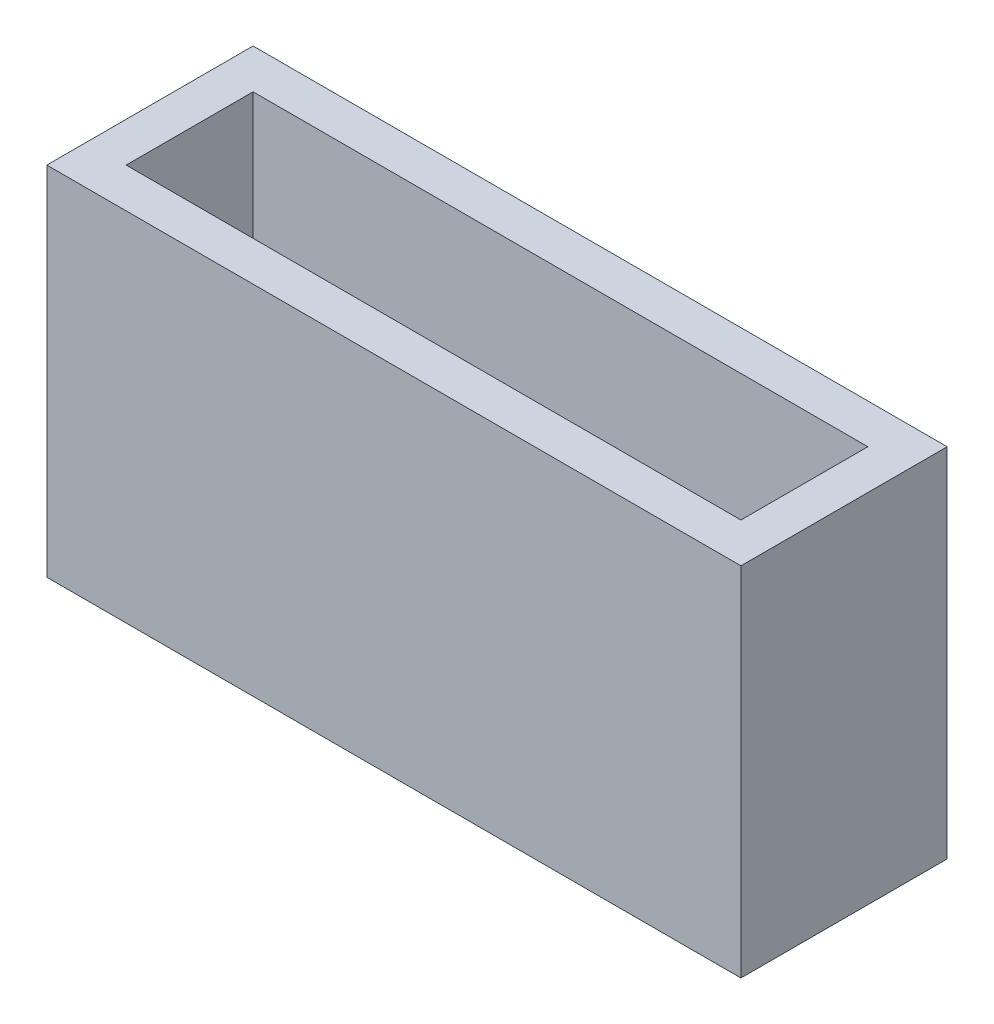
ISO-10303-21;
HEADER;
FILE_DESCRIPTION(('STEP AP214'),'2;1');
FILE_NAME('part.step','',(''),(''),'','','');
FILE_SCHEMA(('AUTOMOTIVE_DESIGN { 1 0 10303 214 1 1 1 1 }'));
ENDSEC;
DATA;
#1=APPLICATION_CONTEXT('core data for automotive mechanical design processes');
#2=APPLICATION_PROTOCOL_DEFINITION('international standard','automotive_design',2000,#1);
#3=PRODUCT_CONTEXT('',#1,'mechanical');
#4=PRODUCT('Part','Part','',(#3));
#5=PRODUCT_RELATED_PRODUCT_CATEGORY('part','',(#4));
#6=PRODUCT_DEFINITION_FORMATION('','',#4);
#7=PRODUCT_DEFINITION_CONTEXT('part definition',#1,'design');
#8=PRODUCT_DEFINITION('design','',#6,#7);
#9=PRODUCT_DEFINITION_SHAPE('','',#8);
#10=(LENGTH_UNIT() NAMED_UNIT(*) SI_UNIT(.MILLI.,.METRE.));
#11=(NAMED_UNIT(*) PLANE_ANGLE_UNIT() SI_UNIT($,.RADIAN.));
#12=(NAMED_UNIT(*) SI_UNIT($,.STERADIAN.) SOLID_ANGLE_UNIT());
#13=UNCERTAINTY_MEASURE_WITH_UNIT(LENGTH_MEASURE(1.E-05),#10,'distance_accuracy_value','');
#14=(GEOMETRIC_REPRESENTATION_CONTEXT(3) GLOBAL_UNCERTAINTY_ASSIGNED_CONTEXT((#13)) GLOBAL_UNIT_ASSIGNED_CONTEXT((#10,
#11,#12)) REPRESENTATION_CONTEXT('',''));
#15=CARTESIAN_POINT('',(0.,0.,0.));
#16=DIRECTION('',(0.,0.,1.));
#17=DIRECTION('',(1.,0.,0.));
#18=AXIS2_PLACEMENT_3D('',#15,#16,#17);
#19=CARTESIAN_POINT('',(0.,7.5,0.));
#20=DIRECTION('',(0.,1.,0.));
#21=DIRECTION('',(0.,0.,1.));
#22=AXIS2_PLACEMENT_3D('',#19,#20,#21);
#23=PLANE('',#22);
#24=DIRECTION('',(1.,0.,0.));
#25=VECTOR('',#24,1.);
#26=CARTESIAN_POINT('',(-1.,7.5,1.));
#27=LINE('',#26,#25);
#28=CARTESIAN_POINT('',(-1.,7.5,1.));
#29=VERTEX_POINT('',#28);
#30=CARTESIAN_POINT('',(16.5,7.5,1.));
#31=VERTEX_POINT('',#30);
#32=EDGE_CURVE('E176',#29,#31,#27,.T.);
#33=ORIENTED_EDGE('',*,*,#32,.T.);
#34=DIRECTION('',(0.,0.,-1.));
#35=VECTOR('',#34,1.);
#36=CARTESIAN_POINT('',(16.5,7.5,1.));
#37=LINE('',#36,#35);
#38=CARTESIAN_POINT('',(16.5,7.5,-4.2));
#39=VERTEX_POINT('',#38);
#40=EDGE_CURVE('E179',#31,#39,#37,.T.);
#41=ORIENTED_EDGE('',*,*,#40,.T.);
#42=DIRECTION('',(-1.,0.,0.));
#43=VECTOR('',#42,1.);
#44=CARTESIAN_POINT('',(-1.,7.5,-4.2));
#45=LINE('',#44,#43);
#46=CARTESIAN_POINT('',(-1.,7.5,-4.2));
#47=VERTEX_POINT('',#46);
#48=EDGE_CURVE('E182',#39,#47,#45,.T.);
#49=ORIENTED_EDGE('',*,*,#48,.T.);
#50=DIRECTION('',(0.,0.,1.));
#51=VECTOR('',#50,1.);
#52=CARTESIAN_POINT('',(-1.,7.5,1.));
#53=LINE('',#52,#51);
#54=EDGE_CURVE('E63',#47,#29,#53,.T.);
#55=ORIENTED_EDGE('',*,*,#54,.T.);
#56=EDGE_LOOP('',(#33,#41,#49,#55));
#57=FACE_BOUND('',#56,.T.);
#58=DIRECTION('',(1.,0.,0.));
#59=VECTOR('',#58,1.);
#60=CARTESIAN_POINT('',(0.,7.5,0.));
#61=LINE('',#60,#59);
#62=CARTESIAN_POINT('',(0.,7.5,0.));
#63=VERTEX_POINT('',#62);
#64=CARTESIAN_POINT('',(15.5,7.5,0.));
#65=VERTEX_POINT('',#64);
#66=EDGE_CURVE('E140',#63,#65,#61,.T.);
#67=ORIENTED_EDGE('',*,*,#66,.F.);
#68=DIRECTION('',(0.,0.,1.));
#69=VECTOR('',#68,1.);
#70=CARTESIAN_POINT('',(0.,7.5,0.));
#71=LINE('',#70,#69);
#72=CARTESIAN_POINT('',(0.,7.5,-3.2));
#73=VERTEX_POINT('',#72);
#74=EDGE_CURVE('E137',#73,#63,#71,.T.);
#75=ORIENTED_EDGE('',*,*,#74,.F.);
#76=DIRECTION('',(-1.,0.,0.));
#77=VECTOR('',#76,1.);
#78=CARTESIAN_POINT('',(0.,7.5,-3.2));
#79=LINE('',#78,#77);
#80=CARTESIAN_POINT('',(15.5,7.5,-3.2));
#81=VERTEX_POINT('',#80);
#82=EDGE_CURVE('E147',#81,#73,#79,.T.);
#83=ORIENTED_EDGE('',*,*,#82,.F.);
#84=DIRECTION('',(0.,0.,-1.));
#85=VECTOR('',#84,1.);
#86=CARTESIAN_POINT('',(15.5,7.5,0.));
#87=LINE('',#86,#85);
#88=EDGE_CURVE('E144',#65,#81,#87,.T.);
#89=ORIENTED_EDGE('',*,*,#88,.F.);
#90=EDGE_LOOP('',(#67,#75,#83,#89));
#91=FACE_BOUND('',#90,.T.);
#92=ADVANCED_FACE('F39',(#57,#91),#23,.T.);
#93=CARTESIAN_POINT('',(-1.,7.5,1.));
#94=DIRECTION('',(0.,0.,-1.));
#95=DIRECTION('',(-1.,0.,0.));
#96=AXIS2_PLACEMENT_3D('',#93,#94,#95);
#97=PLANE('',#96);
#98=DIRECTION('',(0.,-1.,0.));
#99=VECTOR('',#98,1.);
#100=CARTESIAN_POINT('',(-1.,7.5,1.));
#101=LINE('',#100,#99);
#102=CARTESIAN_POINT('',(-1.,-1.5,1.));
#103=VERTEX_POINT('',#102);
#104=EDGE_CURVE('E113',#29,#103,#101,.T.);
#105=ORIENTED_EDGE('',*,*,#104,.T.);
#106=DIRECTION('',(-1.,0.,0.));
#107=VECTOR('',#106,1.);
#108=CARTESIAN_POINT('',(-1.,-1.5,1.));
#109=LINE('',#108,#107);
#110=CARTESIAN_POINT('',(16.5,-1.5,1.));
#111=VERTEX_POINT('',#110);
#112=EDGE_CURVE('E128',#111,#103,#109,.T.);
#113=ORIENTED_EDGE('',*,*,#112,.F.);
#114=DIRECTION('',(0.,-1.,0.));
#115=VECTOR('',#114,1.);
#116=CARTESIAN_POINT('',(16.5,7.5,1.));
#117=LINE('',#116,#115);
#118=EDGE_CURVE('E11',#31,#111,#117,.T.);
#119=ORIENTED_EDGE('',*,*,#118,.F.);
#120=ORIENTED_EDGE('',*,*,#32,.F.);
#121=EDGE_LOOP('',(#105,#113,#119,#120));
#122=FACE_BOUND('',#121,.T.);
#123=ADVANCED_FACE('F41',(#122),#97,.F.);
#124=CARTESIAN_POINT('',(16.5,7.5,1.));
#125=DIRECTION('',(-1.,0.,0.));
#126=DIRECTION('',(0.,0.,1.));
#127=AXIS2_PLACEMENT_3D('',#124,#125,#126);
#128=PLANE('',#127);
#129=ORIENTED_EDGE('',*,*,#118,.T.);
#130=DIRECTION('',(0.,0.,1.));
#131=VECTOR('',#130,1.);
#132=CARTESIAN_POINT('',(16.5,-1.5,1.));
#133=LINE('',#132,#131);
#134=CARTESIAN_POINT('',(16.5,-1.5,-4.2));
#135=VERTEX_POINT('',#134);
#136=EDGE_CURVE('E123',#135,#111,#133,.T.);
#137=ORIENTED_EDGE('',*,*,#136,.F.);
#138=DIRECTION('',(0.,-1.,0.));
#139=VECTOR('',#138,1.);
#140=CARTESIAN_POINT('',(16.5,7.5,-4.2));
#141=LINE('',#140,#139);
#142=EDGE_CURVE('E48',#39,#135,#141,.T.);
#143=ORIENTED_EDGE('',*,*,#142,.F.);
#144=ORIENTED_EDGE('',*,*,#40,.F.);
#145=EDGE_LOOP('',(#129,#137,#143,#144));
#146=FACE_BOUND('',#145,.T.);
#147=ADVANCED_FACE('F194',(#146),#128,.F.);
#148=CARTESIAN_POINT('',(-1.,7.5,-4.2));
#149=DIRECTION('',(0.,0.,1.));
#150=DIRECTION('',(1.,0.,0.));
#151=AXIS2_PLACEMENT_3D('',#148,#149,#150);
#152=PLANE('',#151);
#153=ORIENTED_EDGE('',*,*,#142,.T.);
#154=DIRECTION('',(1.,0.,0.));
#155=VECTOR('',#154,1.);
#156=CARTESIAN_POINT('',(-0.999999999999999,-1.5,-4.2));
#157=LINE('',#156,#155);
#158=CARTESIAN_POINT('',(-0.999999999999999,-1.5,-4.2));
#159=VERTEX_POINT('',#158);
#160=EDGE_CURVE('E116',#159,#135,#157,.T.);
#161=ORIENTED_EDGE('',*,*,#160,.F.);
#162=DIRECTION('',(0.,-1.,0.));
#163=VECTOR('',#162,1.);
#164=CARTESIAN_POINT('',(-1.,7.5,-4.2));
#165=LINE('',#164,#163);
#166=EDGE_CURVE('E105',#47,#159,#165,.T.);
#167=ORIENTED_EDGE('',*,*,#166,.F.);
#168=ORIENTED_EDGE('',*,*,#48,.F.);
#169=EDGE_LOOP('',(#153,#161,#167,#168));
#170=FACE_BOUND('',#169,.T.);
#171=ADVANCED_FACE('F117',(#170),#152,.F.);
#172=CARTESIAN_POINT('',(-1.,7.5,1.));
#173=DIRECTION('',(1.,0.,0.));
#174=DIRECTION('',(0.,0.,-1.));
#175=AXIS2_PLACEMENT_3D('',#172,#173,#174);
#176=PLANE('',#175);
#177=ORIENTED_EDGE('',*,*,#166,.T.);
#178=DIRECTION('',(0.,0.,-1.));
#179=VECTOR('',#178,1.);
#180=CARTESIAN_POINT('',(-1.,-1.5,1.));
#181=LINE('',#180,#179);
#182=EDGE_CURVE('E109',#103,#159,#181,.T.);
#183=ORIENTED_EDGE('',*,*,#182,.F.);
#184=ORIENTED_EDGE('',*,*,#104,.F.);
#185=ORIENTED_EDGE('',*,*,#54,.F.);
#186=EDGE_LOOP('',(#177,#183,#184,#185));
#187=FACE_BOUND('',#186,.T.);
#188=ADVANCED_FACE('F107',(#187),#176,.F.);
#189=CARTESIAN_POINT('',(0.,7.5,0.));
#190=DIRECTION('',(1.,0.,0.));
#191=DIRECTION('',(0.,0.,-1.));
#192=AXIS2_PLACEMENT_3D('',#189,#190,#191);
#193=PLANE('',#192);
#194=DIRECTION('',(0.,0.,1.));
#195=VECTOR('',#194,1.);
#196=CARTESIAN_POINT('',(0.,0.,0.));
#197=LINE('',#196,#195);
#198=CARTESIAN_POINT('',(0.,0.,-3.2));
#199=VERTEX_POINT('',#198);
#200=CARTESIAN_POINT('',(0.,0.,0.));
#201=VERTEX_POINT('',#200);
#202=EDGE_CURVE('E136',#199,#201,#197,.T.);
#203=ORIENTED_EDGE('',*,*,#202,.F.);
#204=DIRECTION('',(0.,-1.,0.));
#205=VECTOR('',#204,1.);
#206=CARTESIAN_POINT('',(0.,7.5,-3.2));
#207=LINE('',#206,#205);
#208=EDGE_CURVE('E150',#73,#199,#207,.T.);
#209=ORIENTED_EDGE('',*,*,#208,.F.);
#210=ORIENTED_EDGE('',*,*,#74,.T.);
#211=DIRECTION('',(0.,-1.,0.));
#212=VECTOR('',#211,1.);
#213=CARTESIAN_POINT('',(0.,7.5,0.));
#214=LINE('',#213,#212);
#215=EDGE_CURVE('E172',#63,#201,#214,.T.);
#216=ORIENTED_EDGE('',*,*,#215,.T.);
#217=EDGE_LOOP('',(#203,#209,#210,#216));
#218=FACE_BOUND('',#217,.T.);
#219=ADVANCED_FACE('F207',(#218),#193,.T.);
#220=CARTESIAN_POINT('',(0.,7.5,0.));
#221=DIRECTION('',(0.,0.,-1.));
#222=DIRECTION('',(-1.,0.,0.));
#223=AXIS2_PLACEMENT_3D('',#220,#221,#222);
#224=PLANE('',#223);
#225=DIRECTION('',(1.,0.,0.));
#226=VECTOR('',#225,1.);
#227=CARTESIAN_POINT('',(0.,0.,0.));
#228=LINE('',#227,#226);
#229=CARTESIAN_POINT('',(15.5,0.,0.));
#230=VERTEX_POINT('',#229);
#231=EDGE_CURVE('E154',#201,#230,#228,.T.);
#232=ORIENTED_EDGE('',*,*,#231,.F.);
#233=ORIENTED_EDGE('',*,*,#215,.F.);
#234=ORIENTED_EDGE('',*,*,#66,.T.);
#235=DIRECTION('',(0.,-1.,0.));
#236=VECTOR('',#235,1.);
#237=CARTESIAN_POINT('',(15.5,7.5,0.));
#238=LINE('',#237,#236);
#239=EDGE_CURVE('E169',#65,#230,#238,.T.);
#240=ORIENTED_EDGE('',*,*,#239,.T.);
#241=EDGE_LOOP('',(#232,#233,#234,#240));
#242=FACE_BOUND('',#241,.T.);
#243=ADVANCED_FACE('F213',(#242),#224,.T.);
#244=CARTESIAN_POINT('',(15.5,7.5,0.));
#245=DIRECTION('',(-1.,0.,0.));
#246=DIRECTION('',(0.,0.,1.));
#247=AXIS2_PLACEMENT_3D('',#244,#245,#246);
#248=PLANE('',#247);
#249=DIRECTION('',(0.,0.,-1.));
#250=VECTOR('',#249,1.);
#251=CARTESIAN_POINT('',(15.5,0.,0.));
#252=LINE('',#251,#250);
#253=CARTESIAN_POINT('',(15.5,0.,-3.2));
#254=VERTEX_POINT('',#253);
#255=EDGE_CURVE('E158',#230,#254,#252,.T.);
#256=ORIENTED_EDGE('',*,*,#255,.F.);
#257=ORIENTED_EDGE('',*,*,#239,.F.);
#258=ORIENTED_EDGE('',*,*,#88,.T.);
#259=DIRECTION('',(0.,-1.,0.));
#260=VECTOR('',#259,1.);
#261=CARTESIAN_POINT('',(15.5,7.5,-3.2));
#262=LINE('',#261,#260);
#263=EDGE_CURVE('E55',#81,#254,#262,.T.);
#264=ORIENTED_EDGE('',*,*,#263,.T.);
#265=EDGE_LOOP('',(#256,#257,#258,#264));
#266=FACE_BOUND('',#265,.T.);
#267=ADVANCED_FACE('F218',(#266),#248,.T.);
#268=CARTESIAN_POINT('',(0.,7.5,-3.2));
#269=DIRECTION('',(0.,0.,1.));
#270=DIRECTION('',(1.,0.,0.));
#271=AXIS2_PLACEMENT_3D('',#268,#269,#270);
#272=PLANE('',#271);
#273=DIRECTION('',(-1.,0.,0.));
#274=VECTOR('',#273,1.);
#275=CARTESIAN_POINT('',(0.,0.,-3.2));
#276=LINE('',#275,#274);
#277=EDGE_CURVE('E141',#254,#199,#276,.T.);
#278=ORIENTED_EDGE('',*,*,#277,.F.);
#279=ORIENTED_EDGE('',*,*,#263,.F.);
#280=ORIENTED_EDGE('',*,*,#82,.T.);
#281=ORIENTED_EDGE('',*,*,#208,.T.);
#282=EDGE_LOOP('',(#278,#279,#280,#281));
#283=FACE_BOUND('',#282,.T.);
#284=ADVANCED_FACE('F227',(#283),#272,.T.);
#285=CARTESIAN_POINT('',(0.,0.,0.));
#286=DIRECTION('',(0.,-1.,0.));
#287=DIRECTION('',(0.,0.,-1.));
#288=AXIS2_PLACEMENT_3D('',#285,#286,#287);
#289=PLANE('',#288);
#290=ORIENTED_EDGE('',*,*,#277,.T.);
#291=ORIENTED_EDGE('',*,*,#202,.T.);
#292=ORIENTED_EDGE('',*,*,#231,.T.);
#293=ORIENTED_EDGE('',*,*,#255,.T.);
#294=EDGE_LOOP('',(#290,#291,#292,#293));
#295=FACE_BOUND('',#294,.T.);
#296=ADVANCED_FACE('F225',(#295),#289,.F.);
#297=CARTESIAN_POINT('',(0.,-1.5,0.));
#298=DIRECTION('',(0.,-1.,0.));
#299=DIRECTION('',(0.,0.,-1.));
#300=AXIS2_PLACEMENT_3D('',#297,#298,#299);
#301=PLANE('',#300);
#302=ORIENTED_EDGE('',*,*,#182,.T.);
#303=ORIENTED_EDGE('',*,*,#160,.T.);
#304=ORIENTED_EDGE('',*,*,#136,.T.);
#305=ORIENTED_EDGE('',*,*,#112,.T.);
#306=EDGE_LOOP('',(#302,#303,#304,#305));
#307=FACE_BOUND('',#306,.T.);
#308=ADVANCED_FACE('F126',(#307),#301,.T.);
#309=CLOSED_SHELL('',(#92,#123,#147,#171,#188,#219,#243,#267,#284,#296,#308));
#310=MANIFOLD_SOLID_BREP('B2',#309);
#311=ADVANCED_BREP_SHAPE_REPRESENTATION('',(#18,#310),#14);
#312=SHAPE_DEFINITION_REPRESENTATION(#9,#311);
ENDSEC;
END-ISO-10303-21;
